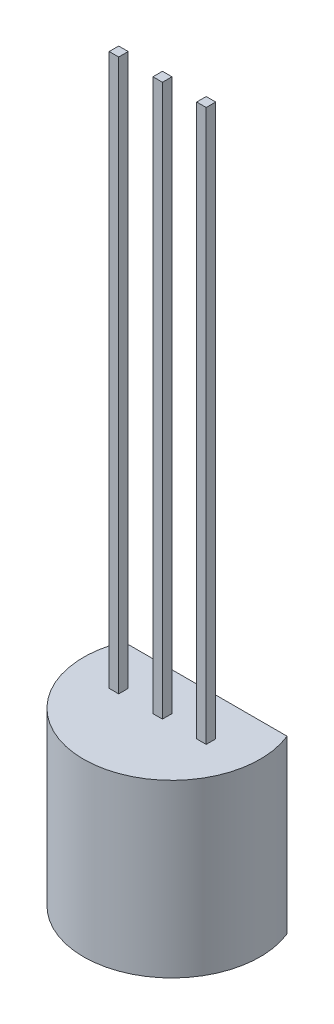
ISO-10303-21;
HEADER;
FILE_DESCRIPTION(('STEP AP214'),'2;1');
FILE_NAME('part.step','',(''),(''),'','','');
FILE_SCHEMA(('AUTOMOTIVE_DESIGN { 1 0 10303 214 1 1 1 1 }'));
ENDSEC;
DATA;
#1=APPLICATION_CONTEXT('core data for automotive mechanical design processes');
#2=APPLICATION_PROTOCOL_DEFINITION('international standard','automotive_design',2000,#1);
#3=PRODUCT_CONTEXT('',#1,'mechanical');
#4=PRODUCT('Part','Part','',(#3));
#5=PRODUCT_RELATED_PRODUCT_CATEGORY('part','',(#4));
#6=PRODUCT_DEFINITION_FORMATION('','',#4);
#7=PRODUCT_DEFINITION_CONTEXT('part definition',#1,'design');
#8=PRODUCT_DEFINITION('design','',#6,#7);
#9=PRODUCT_DEFINITION_SHAPE('','',#8);
#10=(LENGTH_UNIT() NAMED_UNIT(*) SI_UNIT(.MILLI.,.METRE.));
#11=(NAMED_UNIT(*) PLANE_ANGLE_UNIT() SI_UNIT($,.RADIAN.));
#12=(NAMED_UNIT(*) SI_UNIT($,.STERADIAN.) SOLID_ANGLE_UNIT());
#13=UNCERTAINTY_MEASURE_WITH_UNIT(LENGTH_MEASURE(1.E-05),#10,'distance_accuracy_value','');
#14=(GEOMETRIC_REPRESENTATION_CONTEXT(3) GLOBAL_UNCERTAINTY_ASSIGNED_CONTEXT((#13)) GLOBAL_UNIT_ASSIGNED_CONTEXT((#10,
#11,#12)) REPRESENTATION_CONTEXT('',''));
#15=CARTESIAN_POINT('',(0.,0.,0.));
#16=DIRECTION('',(0.,0.,1.));
#17=DIRECTION('',(1.,0.,0.));
#18=AXIS2_PLACEMENT_3D('',#15,#16,#17);
#19=CARTESIAN_POINT('',(2.15,4.5,0.877734375));
#20=DIRECTION('',(0.,1.,0.));
#21=DIRECTION('',(0.,0.,1.));
#22=AXIS2_PLACEMENT_3D('',#19,#20,#21);
#23=PLANE('',#22);
#24=CARTESIAN_POINT('',(2.15,4.5,0.877734375));
#25=DIRECTION('',(0.,1.,0.));
#26=DIRECTION('',(0.,0.,1.));
#27=AXIS2_PLACEMENT_3D('',#24,#25,#26);
#28=CIRCLE('',#27,2.322265625);
#29=CARTESIAN_POINT('',(0.,4.5,0.));
#30=VERTEX_POINT('',#29);
#31=CARTESIAN_POINT('',(4.3,4.5,0.));
#32=VERTEX_POINT('',#31);
#33=EDGE_CURVE('E262',#30,#32,#28,.T.);
#34=ORIENTED_EDGE('',*,*,#33,.T.);
#35=DIRECTION('',(-1.,0.,0.));
#36=VECTOR('',#35,1.);
#37=CARTESIAN_POINT('',(0.,4.5,0.));
#38=LINE('',#37,#36);
#39=EDGE_CURVE('E266',#32,#30,#38,.T.);
#40=ORIENTED_EDGE('',*,*,#39,.T.);
#41=EDGE_LOOP('',(#34,#40));
#42=FACE_BOUND('',#41,.T.);
#43=DIRECTION('',(1.,0.,0.));
#44=VECTOR('',#43,1.);
#45=CARTESIAN_POINT('',(2.025,4.5,1.25));
#46=LINE('',#45,#44);
#47=CARTESIAN_POINT('',(2.025,4.5,1.25));
#48=VERTEX_POINT('',#47);
#49=CARTESIAN_POINT('',(2.275,4.5,1.25));
#50=VERTEX_POINT('',#49);
#51=EDGE_CURVE('E239',#48,#50,#46,.T.);
#52=ORIENTED_EDGE('',*,*,#51,.F.);
#53=DIRECTION('',(0.,0.,1.));
#54=VECTOR('',#53,1.);
#55=CARTESIAN_POINT('',(2.025,4.5,1.));
#56=LINE('',#55,#54);
#57=CARTESIAN_POINT('',(2.025,4.5,1.));
#58=VERTEX_POINT('',#57);
#59=EDGE_CURVE('E220',#58,#48,#56,.T.);
#60=ORIENTED_EDGE('',*,*,#59,.F.);
#61=DIRECTION('',(-1.,0.,0.));
#62=VECTOR('',#61,1.);
#63=CARTESIAN_POINT('',(2.025,4.5,1.));
#64=LINE('',#63,#62);
#65=CARTESIAN_POINT('',(2.275,4.5,1.));
#66=VERTEX_POINT('',#65);
#67=EDGE_CURVE('E226',#66,#58,#64,.T.);
#68=ORIENTED_EDGE('',*,*,#67,.F.);
#69=DIRECTION('',(0.,0.,-1.));
#70=VECTOR('',#69,1.);
#71=CARTESIAN_POINT('',(2.275,4.5,1.));
#72=LINE('',#71,#70);
#73=EDGE_CURVE('E242',#50,#66,#72,.T.);
#74=ORIENTED_EDGE('',*,*,#73,.F.);
#75=EDGE_LOOP('',(#52,#60,#68,#74));
#76=FACE_BOUND('',#75,.T.);
#77=DIRECTION('',(1.,0.,0.));
#78=VECTOR('',#77,1.);
#79=CARTESIAN_POINT('',(3.175,4.5,1.25));
#80=LINE('',#79,#78);
#81=CARTESIAN_POINT('',(3.175,4.5,1.25));
#82=VERTEX_POINT('',#81);
#83=CARTESIAN_POINT('',(3.425,4.5,1.25));
#84=VERTEX_POINT('',#83);
#85=EDGE_CURVE('E180',#82,#84,#80,.T.);
#86=ORIENTED_EDGE('',*,*,#85,.F.);
#87=DIRECTION('',(0.,0.,1.));
#88=VECTOR('',#87,1.);
#89=CARTESIAN_POINT('',(3.175,4.5,1.));
#90=LINE('',#89,#88);
#91=CARTESIAN_POINT('',(3.175,4.5,1.));
#92=VERTEX_POINT('',#91);
#93=EDGE_CURVE('E174',#92,#82,#90,.T.);
#94=ORIENTED_EDGE('',*,*,#93,.F.);
#95=DIRECTION('',(-1.,0.,0.));
#96=VECTOR('',#95,1.);
#97=CARTESIAN_POINT('',(3.175,4.5,1.));
#98=LINE('',#97,#96);
#99=CARTESIAN_POINT('',(3.425,4.5,1.));
#100=VERTEX_POINT('',#99);
#101=EDGE_CURVE('E191',#100,#92,#98,.T.);
#102=ORIENTED_EDGE('',*,*,#101,.F.);
#103=DIRECTION('',(0.,0.,-1.));
#104=VECTOR('',#103,1.);
#105=CARTESIAN_POINT('',(3.425,4.5,1.));
#106=LINE('',#105,#104);
#107=EDGE_CURVE('E203',#84,#100,#106,.T.);
#108=ORIENTED_EDGE('',*,*,#107,.F.);
#109=EDGE_LOOP('',(#86,#94,#102,#108));
#110=FACE_BOUND('',#109,.T.);
#111=DIRECTION('',(1.,0.,0.));
#112=VECTOR('',#111,1.);
#113=CARTESIAN_POINT('',(0.875,4.5,1.25000000000001));
#114=LINE('',#113,#112);
#115=CARTESIAN_POINT('',(0.875,4.5,1.25000000000001));
#116=VERTEX_POINT('',#115);
#117=CARTESIAN_POINT('',(1.125,4.5,1.25000000000001));
#118=VERTEX_POINT('',#117);
#119=EDGE_CURVE('E299',#116,#118,#114,.T.);
#120=ORIENTED_EDGE('',*,*,#119,.F.);
#121=DIRECTION('',(0.,0.,1.));
#122=VECTOR('',#121,1.);
#123=CARTESIAN_POINT('',(0.875,4.5,1.00000000000001));
#124=LINE('',#123,#122);
#125=CARTESIAN_POINT('',(0.875,4.5,1.00000000000001));
#126=VERTEX_POINT('',#125);
#127=EDGE_CURVE('E171',#126,#116,#124,.T.);
#128=ORIENTED_EDGE('',*,*,#127,.F.);
#129=DIRECTION('',(-1.,0.,0.));
#130=VECTOR('',#129,1.);
#131=CARTESIAN_POINT('',(0.875,4.5,1.00000000000001));
#132=LINE('',#131,#130);
#133=CARTESIAN_POINT('',(1.125,4.5,1.00000000000001));
#134=VERTEX_POINT('',#133);
#135=EDGE_CURVE('E167',#134,#126,#132,.T.);
#136=ORIENTED_EDGE('',*,*,#135,.F.);
#137=DIRECTION('',(0.,0.,-1.));
#138=VECTOR('',#137,1.);
#139=CARTESIAN_POINT('',(1.125,4.5,1.00000000000001));
#140=LINE('',#139,#138);
#141=EDGE_CURVE('E301',#118,#134,#140,.T.);
#142=ORIENTED_EDGE('',*,*,#141,.F.);
#143=EDGE_LOOP('',(#120,#128,#136,#142));
#144=FACE_BOUND('',#143,.T.);
#145=ADVANCED_FACE('F43',(#42,#76,#110,#144),#23,.T.);
#146=CARTESIAN_POINT('',(2.15,4.5,0.877734375));
#147=DIRECTION('',(0.,-1.,0.));
#148=DIRECTION('',(0.,0.,-1.));
#149=AXIS2_PLACEMENT_3D('',#146,#147,#148);
#150=CYLINDRICAL_SURFACE('',#149,2.322265625);
#151=CARTESIAN_POINT('',(2.15,0.,0.877734375));
#152=DIRECTION('',(0.,1.,0.));
#153=DIRECTION('',(0.,0.,1.));
#154=AXIS2_PLACEMENT_3D('',#151,#152,#153);
#155=CIRCLE('',#154,2.322265625);
#156=CARTESIAN_POINT('',(0.,0.,0.));
#157=VERTEX_POINT('',#156);
#158=CARTESIAN_POINT('',(4.3,0.,0.));
#159=VERTEX_POINT('',#158);
#160=EDGE_CURVE('E261',#157,#159,#155,.T.);
#161=ORIENTED_EDGE('',*,*,#160,.T.);
#162=DIRECTION('',(0.,-1.,0.));
#163=VECTOR('',#162,1.);
#164=CARTESIAN_POINT('',(4.3,4.5,0.));
#165=LINE('',#164,#163);
#166=EDGE_CURVE('E11',#32,#159,#165,.T.);
#167=ORIENTED_EDGE('',*,*,#166,.F.);
#168=ORIENTED_EDGE('',*,*,#33,.F.);
#169=DIRECTION('',(0.,-1.,0.));
#170=VECTOR('',#169,1.);
#171=CARTESIAN_POINT('',(0.,4.5,0.));
#172=LINE('',#171,#170);
#173=EDGE_CURVE('E52',#30,#157,#172,.T.);
#174=ORIENTED_EDGE('',*,*,#173,.T.);
#175=EDGE_LOOP('',(#161,#167,#168,#174));
#176=FACE_BOUND('',#175,.T.);
#177=ADVANCED_FACE('F45',(#176),#150,.T.);
#178=CARTESIAN_POINT('',(0.,4.5,0.));
#179=DIRECTION('',(0.,0.,1.));
#180=DIRECTION('',(1.,0.,0.));
#181=AXIS2_PLACEMENT_3D('',#178,#179,#180);
#182=PLANE('',#181);
#183=DIRECTION('',(-1.,0.,0.));
#184=VECTOR('',#183,1.);
#185=CARTESIAN_POINT('',(0.,0.,0.));
#186=LINE('',#185,#184);
#187=EDGE_CURVE('E267',#159,#157,#186,.T.);
#188=ORIENTED_EDGE('',*,*,#187,.T.);
#189=ORIENTED_EDGE('',*,*,#173,.F.);
#190=ORIENTED_EDGE('',*,*,#39,.F.);
#191=ORIENTED_EDGE('',*,*,#166,.T.);
#192=EDGE_LOOP('',(#188,#189,#190,#191));
#193=FACE_BOUND('',#192,.T.);
#194=ADVANCED_FACE('F285',(#193),#182,.F.);
#195=CARTESIAN_POINT('',(2.15,0.,0.877734375));
#196=DIRECTION('',(0.,1.,0.));
#197=DIRECTION('',(0.,0.,1.));
#198=AXIS2_PLACEMENT_3D('',#195,#196,#197);
#199=PLANE('',#198);
#200=ORIENTED_EDGE('',*,*,#160,.F.);
#201=ORIENTED_EDGE('',*,*,#187,.F.);
#202=EDGE_LOOP('',(#200,#201));
#203=FACE_BOUND('',#202,.T.);
#204=ADVANCED_FACE('F284',(#203),#199,.F.);
#205=CARTESIAN_POINT('',(2.025,19.,1.));
#206=DIRECTION('',(1.,0.,0.));
#207=DIRECTION('',(0.,0.,-1.));
#208=AXIS2_PLACEMENT_3D('',#205,#206,#207);
#209=PLANE('',#208);
#210=ORIENTED_EDGE('',*,*,#59,.T.);
#211=DIRECTION('',(0.,-1.,0.));
#212=VECTOR('',#211,1.);
#213=CARTESIAN_POINT('',(2.025,19.,1.25));
#214=LINE('',#213,#212);
#215=CARTESIAN_POINT('',(2.025,19.,1.25));
#216=VERTEX_POINT('',#215);
#217=EDGE_CURVE('E258',#216,#48,#214,.T.);
#218=ORIENTED_EDGE('',*,*,#217,.F.);
#219=DIRECTION('',(0.,0.,1.));
#220=VECTOR('',#219,1.);
#221=CARTESIAN_POINT('',(2.025,19.,1.));
#222=LINE('',#221,#220);
#223=CARTESIAN_POINT('',(2.025,19.,1.));
#224=VERTEX_POINT('',#223);
#225=EDGE_CURVE('E221',#224,#216,#222,.T.);
#226=ORIENTED_EDGE('',*,*,#225,.F.);
#227=DIRECTION('',(0.,-1.,0.));
#228=VECTOR('',#227,1.);
#229=CARTESIAN_POINT('',(2.025,19.,1.));
#230=LINE('',#229,#228);
#231=EDGE_CURVE('E235',#224,#58,#230,.T.);
#232=ORIENTED_EDGE('',*,*,#231,.T.);
#233=EDGE_LOOP('',(#210,#218,#226,#232));
#234=FACE_BOUND('',#233,.T.);
#235=ADVANCED_FACE('F406',(#234),#209,.F.);
#236=CARTESIAN_POINT('',(2.025,19.,1.25));
#237=DIRECTION('',(0.,0.,-1.));
#238=DIRECTION('',(-1.,0.,0.));
#239=AXIS2_PLACEMENT_3D('',#236,#237,#238);
#240=PLANE('',#239);
#241=ORIENTED_EDGE('',*,*,#51,.T.);
#242=DIRECTION('',(0.,-1.,0.));
#243=VECTOR('',#242,1.);
#244=CARTESIAN_POINT('',(2.275,19.,1.25));
#245=LINE('',#244,#243);
#246=CARTESIAN_POINT('',(2.275,19.,1.25));
#247=VERTEX_POINT('',#246);
#248=EDGE_CURVE('E254',#247,#50,#245,.T.);
#249=ORIENTED_EDGE('',*,*,#248,.F.);
#250=DIRECTION('',(1.,0.,0.));
#251=VECTOR('',#250,1.);
#252=CARTESIAN_POINT('',(2.025,19.,1.25));
#253=LINE('',#252,#251);
#254=EDGE_CURVE('E225',#216,#247,#253,.T.);
#255=ORIENTED_EDGE('',*,*,#254,.F.);
#256=ORIENTED_EDGE('',*,*,#217,.T.);
#257=EDGE_LOOP('',(#241,#249,#255,#256));
#258=FACE_BOUND('',#257,.T.);
#259=ADVANCED_FACE('F402',(#258),#240,.F.);
#260=CARTESIAN_POINT('',(2.275,19.,1.));
#261=DIRECTION('',(-1.,0.,0.));
#262=DIRECTION('',(0.,0.,1.));
#263=AXIS2_PLACEMENT_3D('',#260,#261,#262);
#264=PLANE('',#263);
#265=ORIENTED_EDGE('',*,*,#73,.T.);
#266=DIRECTION('',(0.,-1.,0.));
#267=VECTOR('',#266,1.);
#268=CARTESIAN_POINT('',(2.275,19.,1.));
#269=LINE('',#268,#267);
#270=CARTESIAN_POINT('',(2.275,19.,1.));
#271=VERTEX_POINT('',#270);
#272=EDGE_CURVE('E251',#271,#66,#269,.T.);
#273=ORIENTED_EDGE('',*,*,#272,.F.);
#274=DIRECTION('',(0.,0.,-1.));
#275=VECTOR('',#274,1.);
#276=CARTESIAN_POINT('',(2.275,19.,1.));
#277=LINE('',#276,#275);
#278=EDGE_CURVE('E229',#247,#271,#277,.T.);
#279=ORIENTED_EDGE('',*,*,#278,.F.);
#280=ORIENTED_EDGE('',*,*,#248,.T.);
#281=EDGE_LOOP('',(#265,#273,#279,#280));
#282=FACE_BOUND('',#281,.T.);
#283=ADVANCED_FACE('F398',(#282),#264,.F.);
#284=CARTESIAN_POINT('',(2.025,19.,1.));
#285=DIRECTION('',(0.,0.,1.));
#286=DIRECTION('',(1.,0.,0.));
#287=AXIS2_PLACEMENT_3D('',#284,#285,#286);
#288=PLANE('',#287);
#289=ORIENTED_EDGE('',*,*,#67,.T.);
#290=ORIENTED_EDGE('',*,*,#231,.F.);
#291=DIRECTION('',(-1.,0.,0.));
#292=VECTOR('',#291,1.);
#293=CARTESIAN_POINT('',(2.025,19.,1.));
#294=LINE('',#293,#292);
#295=EDGE_CURVE('E232',#271,#224,#294,.T.);
#296=ORIENTED_EDGE('',*,*,#295,.F.);
#297=ORIENTED_EDGE('',*,*,#272,.T.);
#298=EDGE_LOOP('',(#289,#290,#296,#297));
#299=FACE_BOUND('',#298,.T.);
#300=ADVANCED_FACE('F394',(#299),#288,.F.);
#301=CARTESIAN_POINT('',(0.,19.,0.));
#302=DIRECTION('',(0.,1.,0.));
#303=DIRECTION('',(0.,0.,1.));
#304=AXIS2_PLACEMENT_3D('',#301,#302,#303);
#305=PLANE('',#304);
#306=ORIENTED_EDGE('',*,*,#225,.T.);
#307=ORIENTED_EDGE('',*,*,#254,.T.);
#308=ORIENTED_EDGE('',*,*,#278,.T.);
#309=ORIENTED_EDGE('',*,*,#295,.T.);
#310=EDGE_LOOP('',(#306,#307,#308,#309));
#311=FACE_BOUND('',#310,.T.);
#312=ADVANCED_FACE('F390',(#311),#305,.T.);
#313=CARTESIAN_POINT('',(3.175,19.,1.));
#314=DIRECTION('',(1.,0.,0.));
#315=DIRECTION('',(0.,0.,-1.));
#316=AXIS2_PLACEMENT_3D('',#313,#314,#315);
#317=PLANE('',#316);
#318=ORIENTED_EDGE('',*,*,#93,.T.);
#319=DIRECTION('',(0.,-1.,0.));
#320=VECTOR('',#319,1.);
#321=CARTESIAN_POINT('',(3.175,19.,1.25));
#322=LINE('',#321,#320);
#323=CARTESIAN_POINT('',(3.175,19.,1.25));
#324=VERTEX_POINT('',#323);
#325=EDGE_CURVE('E217',#324,#82,#322,.T.);
#326=ORIENTED_EDGE('',*,*,#325,.F.);
#327=DIRECTION('',(0.,0.,1.));
#328=VECTOR('',#327,1.);
#329=CARTESIAN_POINT('',(3.175,19.,1.));
#330=LINE('',#329,#328);
#331=CARTESIAN_POINT('',(3.175,19.,1.));
#332=VERTEX_POINT('',#331);
#333=EDGE_CURVE('E186',#332,#324,#330,.T.);
#334=ORIENTED_EDGE('',*,*,#333,.F.);
#335=DIRECTION('',(0.,-1.,0.));
#336=VECTOR('',#335,1.);
#337=CARTESIAN_POINT('',(3.175,19.,1.));
#338=LINE('',#337,#336);
#339=EDGE_CURVE('E199',#332,#92,#338,.T.);
#340=ORIENTED_EDGE('',*,*,#339,.T.);
#341=EDGE_LOOP('',(#318,#326,#334,#340));
#342=FACE_BOUND('',#341,.T.);
#343=ADVANCED_FACE('F386',(#342),#317,.F.);
#344=CARTESIAN_POINT('',(3.175,19.,1.25));
#345=DIRECTION('',(0.,0.,-1.));
#346=DIRECTION('',(-1.,0.,0.));
#347=AXIS2_PLACEMENT_3D('',#344,#345,#346);
#348=PLANE('',#347);
#349=ORIENTED_EDGE('',*,*,#85,.T.);
#350=DIRECTION('',(0.,-1.,0.));
#351=VECTOR('',#350,1.);
#352=CARTESIAN_POINT('',(3.425,19.,1.25));
#353=LINE('',#352,#351);
#354=CARTESIAN_POINT('',(3.425,19.,1.25));
#355=VERTEX_POINT('',#354);
#356=EDGE_CURVE('E213',#355,#84,#353,.T.);
#357=ORIENTED_EDGE('',*,*,#356,.F.);
#358=DIRECTION('',(1.,0.,0.));
#359=VECTOR('',#358,1.);
#360=CARTESIAN_POINT('',(3.175,19.,1.25));
#361=LINE('',#360,#359);
#362=EDGE_CURVE('E190',#324,#355,#361,.T.);
#363=ORIENTED_EDGE('',*,*,#362,.F.);
#364=ORIENTED_EDGE('',*,*,#325,.T.);
#365=EDGE_LOOP('',(#349,#357,#363,#364));
#366=FACE_BOUND('',#365,.T.);
#367=ADVANCED_FACE('F382',(#366),#348,.F.);
#368=CARTESIAN_POINT('',(3.425,19.,1.));
#369=DIRECTION('',(-1.,0.,0.));
#370=DIRECTION('',(0.,0.,1.));
#371=AXIS2_PLACEMENT_3D('',#368,#369,#370);
#372=PLANE('',#371);
#373=ORIENTED_EDGE('',*,*,#107,.T.);
#374=DIRECTION('',(0.,-1.,0.));
#375=VECTOR('',#374,1.);
#376=CARTESIAN_POINT('',(3.425,19.,1.));
#377=LINE('',#376,#375);
#378=CARTESIAN_POINT('',(3.425,19.,1.));
#379=VERTEX_POINT('',#378);
#380=EDGE_CURVE('E67',#379,#100,#377,.T.);
#381=ORIENTED_EDGE('',*,*,#380,.F.);
#382=DIRECTION('',(0.,0.,-1.));
#383=VECTOR('',#382,1.);
#384=CARTESIAN_POINT('',(3.425,19.,1.));
#385=LINE('',#384,#383);
#386=EDGE_CURVE('E194',#355,#379,#385,.T.);
#387=ORIENTED_EDGE('',*,*,#386,.F.);
#388=ORIENTED_EDGE('',*,*,#356,.T.);
#389=EDGE_LOOP('',(#373,#381,#387,#388));
#390=FACE_BOUND('',#389,.T.);
#391=ADVANCED_FACE('F379',(#390),#372,.F.);
#392=CARTESIAN_POINT('',(3.175,19.,1.));
#393=DIRECTION('',(0.,0.,1.));
#394=DIRECTION('',(1.,0.,0.));
#395=AXIS2_PLACEMENT_3D('',#392,#393,#394);
#396=PLANE('',#395);
#397=ORIENTED_EDGE('',*,*,#101,.T.);
#398=ORIENTED_EDGE('',*,*,#339,.F.);
#399=DIRECTION('',(-1.,0.,0.));
#400=VECTOR('',#399,1.);
#401=CARTESIAN_POINT('',(3.175,19.,1.));
#402=LINE('',#401,#400);
#403=EDGE_CURVE('E197',#379,#332,#402,.T.);
#404=ORIENTED_EDGE('',*,*,#403,.F.);
#405=ORIENTED_EDGE('',*,*,#380,.T.);
#406=EDGE_LOOP('',(#397,#398,#404,#405));
#407=FACE_BOUND('',#406,.T.);
#408=ADVANCED_FACE('F375',(#407),#396,.F.);
#409=CARTESIAN_POINT('',(0.,19.,0.));
#410=DIRECTION('',(0.,1.,0.));
#411=DIRECTION('',(0.,0.,1.));
#412=AXIS2_PLACEMENT_3D('',#409,#410,#411);
#413=PLANE('',#412);
#414=ORIENTED_EDGE('',*,*,#333,.T.);
#415=ORIENTED_EDGE('',*,*,#362,.T.);
#416=ORIENTED_EDGE('',*,*,#386,.T.);
#417=ORIENTED_EDGE('',*,*,#403,.T.);
#418=EDGE_LOOP('',(#414,#415,#416,#417));
#419=FACE_BOUND('',#418,.T.);
#420=ADVANCED_FACE('F372',(#419),#413,.T.);
#421=CARTESIAN_POINT('',(0.875,19.,1.00000000000001));
#422=DIRECTION('',(1.,0.,0.));
#423=DIRECTION('',(0.,0.,-1.));
#424=AXIS2_PLACEMENT_3D('',#421,#422,#423);
#425=PLANE('',#424);
#426=ORIENTED_EDGE('',*,*,#127,.T.);
#427=DIRECTION('',(0.,-1.,0.));
#428=VECTOR('',#427,1.);
#429=CARTESIAN_POINT('',(0.875,19.,1.25000000000001));
#430=LINE('',#429,#428);
#431=CARTESIAN_POINT('',(0.875,19.,1.25000000000001));
#432=VERTEX_POINT('',#431);
#433=EDGE_CURVE('E150',#432,#116,#430,.T.);
#434=ORIENTED_EDGE('',*,*,#433,.F.);
#435=DIRECTION('',(0.,0.,1.));
#436=VECTOR('',#435,1.);
#437=CARTESIAN_POINT('',(0.875,19.,1.00000000000001));
#438=LINE('',#437,#436);
#439=CARTESIAN_POINT('',(0.875,19.,1.00000000000001));
#440=VERTEX_POINT('',#439);
#441=EDGE_CURVE('E158',#440,#432,#438,.T.);
#442=ORIENTED_EDGE('',*,*,#441,.F.);
#443=DIRECTION('',(0.,-1.,0.));
#444=VECTOR('',#443,1.);
#445=CARTESIAN_POINT('',(0.875,19.,1.00000000000001));
#446=LINE('',#445,#444);
#447=EDGE_CURVE('E313',#440,#126,#446,.T.);
#448=ORIENTED_EDGE('',*,*,#447,.T.);
#449=EDGE_LOOP('',(#426,#434,#442,#448));
#450=FACE_BOUND('',#449,.T.);
#451=ADVANCED_FACE('F169',(#450),#425,.F.);
#452=CARTESIAN_POINT('',(0.875,19.,1.25000000000001));
#453=DIRECTION('',(0.,0.,-1.));
#454=DIRECTION('',(-1.,0.,0.));
#455=AXIS2_PLACEMENT_3D('',#452,#453,#454);
#456=PLANE('',#455);
#457=ORIENTED_EDGE('',*,*,#119,.T.);
#458=DIRECTION('',(0.,-1.,0.));
#459=VECTOR('',#458,1.);
#460=CARTESIAN_POINT('',(1.125,19.,1.25000000000001));
#461=LINE('',#460,#459);
#462=CARTESIAN_POINT('',(1.125,19.,1.25000000000001));
#463=VERTEX_POINT('',#462);
#464=EDGE_CURVE('E153',#463,#118,#461,.T.);
#465=ORIENTED_EDGE('',*,*,#464,.F.);
#466=DIRECTION('',(1.,0.,0.));
#467=VECTOR('',#466,1.);
#468=CARTESIAN_POINT('',(0.875,19.,1.25000000000001));
#469=LINE('',#468,#467);
#470=EDGE_CURVE('E146',#432,#463,#469,.T.);
#471=ORIENTED_EDGE('',*,*,#470,.F.);
#472=ORIENTED_EDGE('',*,*,#433,.T.);
#473=EDGE_LOOP('',(#457,#465,#471,#472));
#474=FACE_BOUND('',#473,.T.);
#475=ADVANCED_FACE('F148',(#474),#456,.F.);
#476=CARTESIAN_POINT('',(1.125,19.,1.00000000000001));
#477=DIRECTION('',(-1.,0.,0.));
#478=DIRECTION('',(0.,0.,1.));
#479=AXIS2_PLACEMENT_3D('',#476,#477,#478);
#480=PLANE('',#479);
#481=ORIENTED_EDGE('',*,*,#141,.T.);
#482=DIRECTION('',(0.,-1.,0.));
#483=VECTOR('',#482,1.);
#484=CARTESIAN_POINT('',(1.125,19.,1.00000000000001));
#485=LINE('',#484,#483);
#486=CARTESIAN_POINT('',(1.125,19.,1.00000000000001));
#487=VERTEX_POINT('',#486);
#488=EDGE_CURVE('E59',#487,#134,#485,.T.);
#489=ORIENTED_EDGE('',*,*,#488,.F.);
#490=DIRECTION('',(0.,0.,-1.));
#491=VECTOR('',#490,1.);
#492=CARTESIAN_POINT('',(1.125,19.,1.00000000000001));
#493=LINE('',#492,#491);
#494=EDGE_CURVE('E157',#463,#487,#493,.T.);
#495=ORIENTED_EDGE('',*,*,#494,.F.);
#496=ORIENTED_EDGE('',*,*,#464,.T.);
#497=EDGE_LOOP('',(#481,#489,#495,#496));
#498=FACE_BOUND('',#497,.T.);
#499=ADVANCED_FACE('F357',(#498),#480,.F.);
#500=CARTESIAN_POINT('',(0.875,19.,1.00000000000001));
#501=DIRECTION('',(0.,0.,1.));
#502=DIRECTION('',(1.,0.,0.));
#503=AXIS2_PLACEMENT_3D('',#500,#501,#502);
#504=PLANE('',#503);
#505=ORIENTED_EDGE('',*,*,#135,.T.);
#506=ORIENTED_EDGE('',*,*,#447,.F.);
#507=DIRECTION('',(-1.,0.,0.));
#508=VECTOR('',#507,1.);
#509=CARTESIAN_POINT('',(0.875,19.,1.00000000000001));
#510=LINE('',#509,#508);
#511=EDGE_CURVE('E162',#487,#440,#510,.T.);
#512=ORIENTED_EDGE('',*,*,#511,.F.);
#513=ORIENTED_EDGE('',*,*,#488,.T.);
#514=EDGE_LOOP('',(#505,#506,#512,#513));
#515=FACE_BOUND('',#514,.T.);
#516=ADVANCED_FACE('F358',(#515),#504,.F.);
#517=CARTESIAN_POINT('',(0.,19.,0.));
#518=DIRECTION('',(0.,1.,0.));
#519=DIRECTION('',(0.,0.,1.));
#520=AXIS2_PLACEMENT_3D('',#517,#518,#519);
#521=PLANE('',#520);
#522=ORIENTED_EDGE('',*,*,#441,.T.);
#523=ORIENTED_EDGE('',*,*,#470,.T.);
#524=ORIENTED_EDGE('',*,*,#494,.T.);
#525=ORIENTED_EDGE('',*,*,#511,.T.);
#526=EDGE_LOOP('',(#522,#523,#524,#525));
#527=FACE_BOUND('',#526,.T.);
#528=ADVANCED_FACE('F161',(#527),#521,.T.);
#529=CLOSED_SHELL('',(#145,#177,#194,#204,#235,#259,#283,#300,#312,#343,#367,#391,#408,#420,
#451,#475,#499,#516,#528));
#530=MANIFOLD_SOLID_BREP('B2',#529);
#531=ADVANCED_BREP_SHAPE_REPRESENTATION('',(#18,#530),#14);
#532=SHAPE_DEFINITION_REPRESENTATION(#9,#531);
ENDSEC;
END-ISO-10303-21;
